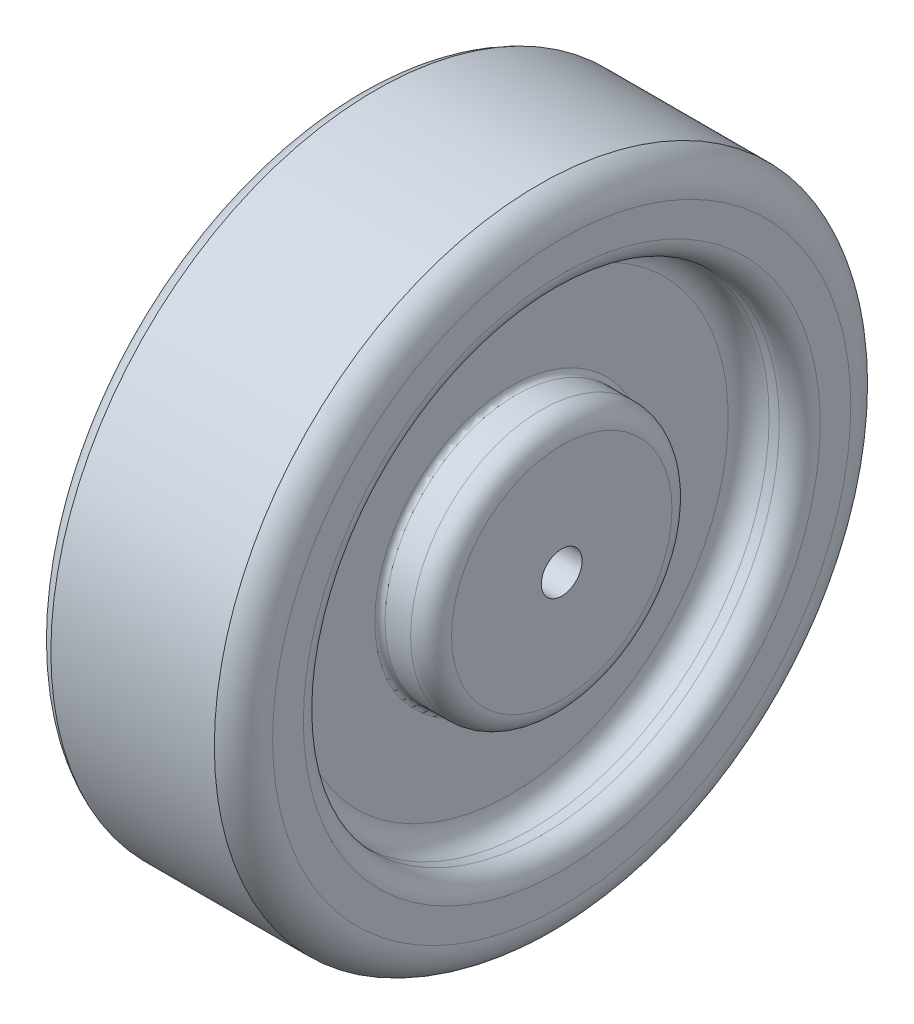
ISO-10303-21;
HEADER;
FILE_DESCRIPTION(('STEP AP214'),'2;1');
FILE_NAME('part.step','',(''),(''),'','','');
FILE_SCHEMA(('AUTOMOTIVE_DESIGN { 1 0 10303 214 1 1 1 1 }'));
ENDSEC;
DATA;
#1=APPLICATION_CONTEXT('core data for automotive mechanical design processes');
#2=APPLICATION_PROTOCOL_DEFINITION('international standard','automotive_design',2000,#1);
#3=PRODUCT_CONTEXT('',#1,'mechanical');
#4=PRODUCT('Part','Part','',(#3));
#5=PRODUCT_RELATED_PRODUCT_CATEGORY('part','',(#4));
#6=PRODUCT_DEFINITION_FORMATION('','',#4);
#7=PRODUCT_DEFINITION_CONTEXT('part definition',#1,'design');
#8=PRODUCT_DEFINITION('design','',#6,#7);
#9=PRODUCT_DEFINITION_SHAPE('','',#8);
#10=(LENGTH_UNIT() NAMED_UNIT(*) SI_UNIT(.MILLI.,.METRE.));
#11=(NAMED_UNIT(*) PLANE_ANGLE_UNIT() SI_UNIT($,.RADIAN.));
#12=(NAMED_UNIT(*) SI_UNIT($,.STERADIAN.) SOLID_ANGLE_UNIT());
#13=UNCERTAINTY_MEASURE_WITH_UNIT(LENGTH_MEASURE(1.E-05),#10,'distance_accuracy_value','');
#14=(GEOMETRIC_REPRESENTATION_CONTEXT(3) GLOBAL_UNCERTAINTY_ASSIGNED_CONTEXT((#13)) GLOBAL_UNIT_ASSIGNED_CONTEXT((#10,
#11,#12)) REPRESENTATION_CONTEXT('',''));
#15=CARTESIAN_POINT('',(0.,0.,0.));
#16=DIRECTION('',(0.,0.,1.));
#17=DIRECTION('',(1.,0.,0.));
#18=AXIS2_PLACEMENT_3D('',#15,#16,#17);
#19=CARTESIAN_POINT('',(13.5100831411217,0.,-3.58222248360619));
#20=DIRECTION('',(-1.,0.,0.));
#21=DIRECTION('',(0.,0.,1.));
#22=AXIS2_PLACEMENT_3D('',#19,#20,#21);
#23=TOROIDAL_SURFACE('',#22,56.9578051056336,7.);
#24=CARTESIAN_POINT('',(20.5,0.,-3.58222248360619));
#25=DIRECTION('',(-1.,0.,0.));
#26=DIRECTION('',(0.,0.,1.));
#27=AXIS2_PLACEMENT_3D('',#24,#25,#26);
#28=CIRCLE('',#27,56.5822224836061);
#29=CARTESIAN_POINT('',(20.5,0.,52.9999999999999));
#30=VERTEX_POINT('',#29);
#31=EDGE_CURVE('E89',#30,#30,#28,.T.);
#32=ORIENTED_EDGE('',*,*,#31,.T.);
#33=EDGE_LOOP('',(#32));
#34=FACE_BOUND('',#33,.T.);
#35=CARTESIAN_POINT('',(16.,0.,-3.58222248360619));
#36=DIRECTION('',(-1.,0.,0.));
#37=DIRECTION('',(0.,0.,1.));
#38=AXIS2_PLACEMENT_3D('',#35,#36,#37);
#39=CIRCLE('',#38,63.5);
#40=CARTESIAN_POINT('',(16.,-63.2036301114344,2.54567607438067));
#41=VERTEX_POINT('',#40);
#42=CARTESIAN_POINT('',(16.,-63.2036301114344,-9.71012104159305));
#43=VERTEX_POINT('',#42);
#44=EDGE_CURVE('E85',#41,#43,#39,.T.);
#45=ORIENTED_EDGE('',*,*,#44,.F.);
#46=CARTESIAN_POINT('',(16.6707270623683,-63.2036301114344,-3.58222248360619));
#47=CARTESIAN_POINT('',(16.6707292954384,-63.2036301114344,-4.17396479603259));
#48=CARTESIAN_POINT('',(16.6544699658295,-63.2036301114344,-4.76571249148176));
#49=CARTESIAN_POINT('',(16.6042972851851,-63.2036301114344,-5.6522356825062));
#50=CARTESIAN_POINT('',(16.5832512617764,-63.2036301114344,-5.94777320771535));
#51=CARTESIAN_POINT('',(16.5319193753858,-63.2036301114344,-6.5380449154142));
#52=CARTESIAN_POINT('',(16.5016339969221,-63.2036301114344,-6.83277913921207));
#53=CARTESIAN_POINT('',(16.4310971773188,-63.2036301114344,-7.41966545961936));
#54=CARTESIAN_POINT('',(16.3908929614594,-63.2036301114344,-7.71182318654436));
#55=CARTESIAN_POINT('',(16.2991330055336,-63.2036301114344,-8.29434503094819));
#56=CARTESIAN_POINT('',(16.24757846675,-63.2036301114344,-8.58470933489647));
#57=CARTESIAN_POINT('',(16.1312813206395,-63.2036301114344,-9.16224071639279));
#58=CARTESIAN_POINT('',(16.0665637722153,-63.2036301114344,-9.44941279152907));
#59=CARTESIAN_POINT('',(15.9210298643362,-63.2036301114344,-10.0195925965211));
#60=CARTESIAN_POINT('',(15.8402229631426,-63.2036301114344,-10.3026026685746));
#61=CARTESIAN_POINT('',(15.7002425886994,-63.2036301114344,-10.7318015172493));
#62=CARTESIAN_POINT('',(15.6484854062445,-63.2036301114344,-10.880410402469));
#63=CARTESIAN_POINT('',(15.5379115914836,-63.2036301114344,-11.1750407205738));
#64=CARTESIAN_POINT('',(15.4790936899521,-63.2036301114344,-11.3210616828272));
#65=CARTESIAN_POINT('',(15.3532741706873,-63.2036301114344,-11.6087313272144));
#66=CARTESIAN_POINT('',(15.2863131973197,-63.2036301114344,-11.7503976344701));
#67=CARTESIAN_POINT('',(15.1419754435748,-63.2036301114344,-12.0284259948148));
#68=CARTESIAN_POINT('',(15.0646000210597,-63.2036301114344,-12.1647887364135));
#69=CARTESIAN_POINT('',(14.9245902761068,-63.2036301114344,-12.385006690551));
#70=CARTESIAN_POINT('',(14.865652843502,-63.2036301114344,-12.471199105611));
#71=CARTESIAN_POINT('',(14.7407382932956,-63.2036301114344,-12.638252843262));
#72=CARTESIAN_POINT('',(14.674769569871,-63.2036301114344,-12.7191203403023));
#73=CARTESIAN_POINT('',(14.5336261190339,-63.2036301114344,-12.8740162026535));
#74=CARTESIAN_POINT('',(14.4583652202557,-63.2036301114344,-12.947967329304));
#75=CARTESIAN_POINT('',(14.2976771951023,-63.2036301114344,-13.0839426676957));
#76=CARTESIAN_POINT('',(14.2122765911409,-63.2036301114344,-13.1459969316784));
#77=CARTESIAN_POINT('',(14.0630478778912,-63.2036301114344,-13.2329681788717));
#78=CARTESIAN_POINT('',(14.0023712240624,-63.2036301114344,-13.2632400984011));
#79=CARTESIAN_POINT('',(13.8770340056613,-63.2036301114344,-13.3139992865462));
#80=CARTESIAN_POINT('',(13.8123782784055,-63.2036301114344,-13.3344981808211));
#81=CARTESIAN_POINT('',(13.6797860652982,-63.2036301114344,-13.3638112738452));
#82=CARTESIAN_POINT('',(13.6118254003782,-63.2036301114344,-13.372519278864));
#83=CARTESIAN_POINT('',(13.4754905390389,-63.2036301114344,-13.3767846314576));
#84=CARTESIAN_POINT('',(13.4071164533096,-63.2036301114344,-13.3723453559382));
#85=CARTESIAN_POINT('',(13.2794513774294,-63.2036301114344,-13.3520425533232));
#86=CARTESIAN_POINT('',(13.2199551888265,-63.2036301114344,-13.3374149457909));
#87=CARTESIAN_POINT('',(13.1038412038322,-63.2036301114344,-13.29943930008));
#88=CARTESIAN_POINT('',(13.0472251717934,-63.2036301114344,-13.2760859880088));
#89=CARTESIAN_POINT('',(12.9066097761618,-63.2036301114344,-13.2071154202081));
#90=CARTESIAN_POINT('',(12.8251438833695,-63.2036301114344,-13.1563663681346));
#91=CARTESIAN_POINT('',(12.6709369166726,-63.2036301114344,-13.042999320279));
#92=CARTESIAN_POINT('',(12.598222850398,-63.2036301114344,-12.9803460489353));
#93=CARTESIAN_POINT('',(12.4661618232911,-63.2036301114344,-12.8524078081409));
#94=CARTESIAN_POINT('',(12.4062107665912,-63.2036301114344,-12.7877350691528));
#95=CARTESIAN_POINT('',(12.2920066418069,-63.2036301114344,-12.6535057755729));
#96=CARTESIAN_POINT('',(12.2377587984906,-63.2036301114344,-12.5839448385105));
#97=CARTESIAN_POINT('',(12.0821510808705,-63.2036301114344,-12.3697464569932));
#98=CARTESIAN_POINT('',(11.9881199762365,-63.2036301114344,-12.2197948939072));
#99=CARTESIAN_POINT('',(11.8366795173049,-63.2036301114344,-11.9509146105457));
#100=CARTESIAN_POINT('',(11.7760229009024,-63.2036301114344,-11.8337321002457));
#101=CARTESIAN_POINT('',(11.6614575369207,-63.2036301114344,-11.5960921177149));
#102=CARTESIAN_POINT('',(11.6075497438011,-63.2036301114344,-11.4756341851797));
#103=CARTESIAN_POINT('',(11.4541061262071,-63.2036301114344,-11.1103037739533));
#104=CARTESIAN_POINT('',(11.3630648657373,-63.2036301114344,-10.8618773201212));
#105=CARTESIAN_POINT('',(11.1975097110628,-63.2036301114344,-10.3584369639931));
#106=CARTESIAN_POINT('',(11.1230770408299,-63.2036301114344,-10.1033972152309));
#107=CARTESIAN_POINT('',(10.9878635021161,-63.2036301114344,-9.59004266804796));
#108=CARTESIAN_POINT('',(10.9270689106355,-63.2036301114344,-9.33173144057175));
#109=CARTESIAN_POINT('',(10.7923023976279,-63.2036301114344,-8.69813742547499));
#110=CARTESIAN_POINT('',(10.7243688989411,-63.2036301114344,-8.32157874943023));
#111=CARTESIAN_POINT('',(10.6073374146122,-63.2036301114344,-7.5654836893905));
#112=CARTESIAN_POINT('',(10.5582465674594,-63.2036301114344,-7.18594623234881));
#113=CARTESIAN_POINT('',(10.4762395281938,-63.2036301114344,-6.42443072444686));
#114=CARTESIAN_POINT('',(10.4433538414906,-63.2036301114344,-6.04244943145213));
#115=CARTESIAN_POINT('',(10.3923139854471,-63.2036301114344,-5.2774999286154));
#116=CARTESIAN_POINT('',(10.3741606342692,-63.2036301114344,-4.8945316651465));
#117=CARTESIAN_POINT('',(10.3517410698331,-63.2036301114344,-4.12682592058159));
#118=CARTESIAN_POINT('',(10.3475246607196,-63.2036301114344,-3.74208700397479));
#119=CARTESIAN_POINT('',(10.3529346520215,-63.2036301114344,-2.97267226223139));
#120=CARTESIAN_POINT('',(10.3625622289784,-63.2036301114344,-2.58799644523612));
#121=CARTESIAN_POINT('',(10.3960565639377,-63.2036301114344,-1.81991024054774));
#122=CARTESIAN_POINT('',(10.4198991609128,-63.2036301114344,-1.43649881312968));
#123=CARTESIAN_POINT('',(10.482887883794,-63.2036301114344,-0.670973940508993));
#124=CARTESIAN_POINT('',(10.5220314981851,-63.2036301114344,-0.288860292665694));
#125=CARTESIAN_POINT('',(10.6178236001986,-63.2036301114344,0.475094570801808));
#126=CARTESIAN_POINT('',(10.6745569837574,-63.2036301114344,0.856925262431808));
#127=CARTESIAN_POINT('',(10.8088290919646,-63.2036301114344,1.61759154547429));
#128=CARTESIAN_POINT('',(10.8863962939935,-63.2036301114344,1.99642230117206));
#129=CARTESIAN_POINT('',(11.022106895567,-63.2036301114344,2.55790361789568));
#130=CARTESIAN_POINT('',(11.0702658832888,-63.2036301114344,2.74297634096623));
#131=CARTESIAN_POINT('',(11.174144944289,-63.2036301114344,3.11097399443569));
#132=CARTESIAN_POINT('',(11.229863472006,-63.2036301114344,3.29389935558182));
#133=CARTESIAN_POINT('',(11.3501561433257,-63.2036301114344,3.65638789420918));
#134=CARTESIAN_POINT('',(11.414710522836,-63.2036301114344,3.83595758652415));
#135=CARTESIAN_POINT('',(11.5547471313071,-63.2036301114344,4.19074313584963));
#136=CARTESIAN_POINT('',(11.6302214866364,-63.2036301114344,4.36596202416937));
#137=CARTESIAN_POINT('',(11.7431393026857,-63.2036301114344,4.60136323030195));
#138=CARTESIAN_POINT('',(11.7745690154131,-63.2036301114344,4.66444189289422));
#139=CARTESIAN_POINT('',(11.8395554887796,-63.2036301114344,4.78949726630312));
#140=CARTESIAN_POINT('',(11.8731124197646,-63.2036301114344,4.85147388835909));
#141=CARTESIAN_POINT('',(11.9774855443031,-63.2036301114344,5.03572568687158));
#142=CARTESIAN_POINT('',(12.0518704228145,-63.2036301114344,5.15603803001532));
#143=CARTESIAN_POINT('',(12.2132532111794,-63.2036301114344,5.38960456408028));
#144=CARTESIAN_POINT('',(12.3003591757373,-63.2036301114344,5.50278502559764));
#145=CARTESIAN_POINT('',(12.4900376992395,-63.2036301114344,5.71539485682873));
#146=CARTESIAN_POINT('',(12.5925497318154,-63.2036301114344,5.81487524222523));
#147=CARTESIAN_POINT('',(12.7619114318647,-63.2036301114344,5.94703293028489));
#148=CARTESIAN_POINT('',(12.8217513124302,-63.2036301114344,5.98861929432739));
#149=CARTESIAN_POINT('',(12.9466415402434,-63.2036301114344,6.06321738996163));
#150=CARTESIAN_POINT('',(13.0116898113155,-63.2036301114344,6.09623251618592));
#151=CARTESIAN_POINT('',(13.1473419165893,-63.2036301114344,6.15134825216223));
#152=CARTESIAN_POINT('',(13.2180053516551,-63.2036301114344,6.17330631390429));
#153=CARTESIAN_POINT('',(13.3622488804833,-63.2036301114344,6.20295821581505));
#154=CARTESIAN_POINT('',(13.4358236036928,-63.2036301114344,6.21067717521244));
#155=CARTESIAN_POINT('',(13.573997842206,-63.2036301114344,6.21078137378157));
#156=CARTESIAN_POINT('',(13.6386012536015,-63.2036301114344,6.20491641059763));
#157=CARTESIAN_POINT('',(13.7658172145653,-63.2036301114344,6.18207391763984));
#158=CARTESIAN_POINT('',(13.8284278593843,-63.2036301114344,6.16508607207167));
#159=CARTESIAN_POINT('',(13.9666268698251,-63.2036301114344,6.11578839943371));
#160=CARTESIAN_POINT('',(14.0411690432026,-63.2036301114344,6.08058424085594));
#161=CARTESIAN_POINT('',(14.1836962770983,-63.2036301114344,5.9988186351449));
#162=CARTESIAN_POINT('',(14.251667333613,-63.2036301114344,5.95223364744086));
#163=CARTESIAN_POINT('',(14.4252734573507,-63.2036301114344,5.81660069013155));
#164=CARTESIAN_POINT('',(14.525104167799,-63.2036301114344,5.72021347843628));
#165=CARTESIAN_POINT('',(14.7101143768368,-63.2036301114344,5.51440180169272));
#166=CARTESIAN_POINT('',(14.7952494541477,-63.2036301114344,5.40493944448867));
#167=CARTESIAN_POINT('',(14.9817095393585,-63.2036301114344,5.13842735391843));
#168=CARTESIAN_POINT('',(15.0783050100692,-63.2036301114344,4.97810910944326));
#169=CARTESIAN_POINT('',(15.2561173954845,-63.2036301114344,4.64904156901644));
#170=CARTESIAN_POINT('',(15.3373033130139,-63.2036301114344,4.48027612455189));
#171=CARTESIAN_POINT('',(15.4880064766111,-63.2036301114344,4.1367419288078));
#172=CARTESIAN_POINT('',(15.5574680299165,-63.2036301114344,3.96194902633201));
#173=CARTESIAN_POINT('',(15.6865902778599,-63.2036301114344,3.60901221541521));
#174=CARTESIAN_POINT('',(15.7462596556362,-63.2036301114344,3.43087143364931));
#175=CARTESIAN_POINT('',(15.8870045022307,-63.2036301114344,2.9772494407193));
#176=CARTESIAN_POINT('',(15.9627139421572,-63.2036301114344,2.70010857469322));
#177=CARTESIAN_POINT('',(16.0993630520884,-63.2036301114344,2.14216124787295));
#178=CARTESIAN_POINT('',(16.1602957438039,-63.2036301114344,1.86135312093346));
#179=CARTESIAN_POINT('',(16.269957117491,-63.2036301114344,1.2968698600959));
#180=CARTESIAN_POINT('',(16.3186639297192,-63.2036301114344,1.01319051962561));
#181=CARTESIAN_POINT('',(16.4054509911811,-63.2036301114344,0.444188756371415));
#182=CARTESIAN_POINT('',(16.4435296449968,-63.2036301114344,0.158866093458514));
#183=CARTESIAN_POINT('',(16.5103307273529,-63.2036301114344,-0.413774970616493));
#184=CARTESIAN_POINT('',(16.5390233007973,-63.2036301114344,-0.701096827346271));
#185=CARTESIAN_POINT('',(16.5876851092299,-63.2036301114344,-1.27648521894518));
#186=CARTESIAN_POINT('',(16.607653726756,-63.2036301114344,-1.56455180507355));
#187=CARTESIAN_POINT('',(16.6552735356061,-63.2036301114344,-2.42868374732805));
#188=CARTESIAN_POINT('',(16.6707248857923,-63.2036301114344,-3.00545055841725));
#189=CARTESIAN_POINT('',(16.6707270623683,-63.2036301114344,-3.58222248360619));
#190=B_SPLINE_CURVE_WITH_KNOTS('',3,(#46,#47,#48,#49,#50,#51,#52,#53,#54,#55,#56,#57,#58,#59,
#60,#61,#62,#63,#64,#65,#66,#67,#68,#69,#70,#71,#72,#73,#74,#75,#76,#77,#78,#79,#80,#81,#82,#83,
#84,#85,#86,#87,#88,#89,#90,#91,#92,#93,#94,#95,#96,#97,#98,#99,#100,#101,#102,#103,#104,#105,
#106,#107,#108,#109,#110,#111,#112,#113,#114,#115,#116,#117,#118,#119,#120,#121,#122,#123,#124,
#125,#126,#127,#128,#129,#130,#131,#132,#133,#134,#135,#136,#137,#138,#139,#140,#141,#142,#143,
#144,#145,#146,#147,#148,#149,#150,#151,#152,#153,#154,#155,#156,#157,#158,#159,#160,#161,#162,
#163,#164,#165,#166,#167,#168,#169,#170,#171,#172,#173,#174,#175,#176,#177,#178,#179,#180,#181,
#182,#183,#184,#185,#186,#187,#188,#189),.UNSPECIFIED.,.T.,.F.,(4,2,2,2,2,2,2,2,2,2,2,2,2,2,2,2,
2,2,2,2,2,2,2,2,2,2,2,2,2,2,2,2,2,2,2,2,2,2,2,2,2,2,2,2,2,2,2,2,2,2,2,2,2,2,2,2,2,2,2,2,2,2,2,2,
2,2,2,2,2,2,2,4),(0.,1.7749163557717,2.66365804093925,3.55235312788315,4.43689599043852,
5.3213452806886,6.2041263127909,7.08638991872182,7.55834551878795,8.03038608435295,
8.50016045788951,8.96987364027671,9.28284606226785,9.59544894642369,9.91120595143281,
10.2261545095402,10.4289177282901,10.6314391412284,10.8357726787345,11.0400537373073,
11.2230931692077,11.406243411187,11.6925312041245,11.9796809667544,12.2438425606726,
12.5082440846066,13.0378759730827,13.4335495027397,13.8292789278861,14.6221006000629,
15.4187184767629,16.2145311434629,17.3618128735386,18.5095288203068,19.6593971095767,
20.8093292525934,21.963366300568,23.1175014310373,24.2696804678306,25.4216704648711,
26.5793093775327,27.7385387709967,28.3121241089263,28.8855923525454,29.4577982061147,
30.029593519309,30.2409831115643,30.4523896531567,30.876144400904,31.3037340944577,
31.7296858130306,31.9477704760255,32.1657686345284,32.3865095539358,32.6068606900769,
32.8004277041079,32.9941744944984,33.2401011488211,33.4865408599805,33.9004968728058,
34.3156830568318,34.8758679452693,35.4371680039533,36.00106355744,36.5644563468123,
37.4257746902768,38.2874990009168,39.1507539580047,40.0141384307289,40.8802430279804,
41.7464089162402,43.4764219676478),.UNSPECIFIED.);
#191=EDGE_CURVE('E74',#41,#43,#190,.T.);
#192=ORIENTED_EDGE('',*,*,#191,.T.);
#193=EDGE_LOOP('',(#45,#192));
#194=FACE_BOUND('',#193,.T.);
#195=ADVANCED_FACE('F46',(#34,#194),#23,.T.);
#196=CARTESIAN_POINT('',(-20.5,0.,-3.58222248360619));
#197=DIRECTION('',(-1.,0.,0.));
#198=DIRECTION('',(0.,0.,1.));
#199=AXIS2_PLACEMENT_3D('',#196,#197,#198);
#200=CYLINDRICAL_SURFACE('',#199,63.5);
#201=ORIENTED_EDGE('',*,*,#44,.T.);
#202=DIRECTION('',(-1.,0.,0.));
#203=VECTOR('',#202,1.);
#204=CARTESIAN_POINT('',(43.5,-63.2036301114344,-9.71012104159305));
#205=LINE('',#204,#203);
#206=CARTESIAN_POINT('',(-16.,-63.2036301114344,-9.71012104159305));
#207=VERTEX_POINT('',#206);
#208=EDGE_CURVE('E76',#43,#207,#205,.T.);
#209=ORIENTED_EDGE('',*,*,#208,.T.);
#210=CARTESIAN_POINT('',(-16.,0.,-3.58222248360619));
#211=DIRECTION('',(-1.,0.,0.));
#212=DIRECTION('',(0.,0.,1.));
#213=AXIS2_PLACEMENT_3D('',#210,#211,#212);
#214=CIRCLE('',#213,63.5);
#215=CARTESIAN_POINT('',(-16.,-63.2036301114344,2.54567607438067));
#216=VERTEX_POINT('',#215);
#217=EDGE_CURVE('E87',#216,#207,#214,.T.);
#218=ORIENTED_EDGE('',*,*,#217,.F.);
#219=DIRECTION('',(-1.,0.,0.));
#220=VECTOR('',#219,1.);
#221=CARTESIAN_POINT('',(43.5,-63.2036301114344,2.54567607438067));
#222=LINE('',#221,#220);
#223=EDGE_CURVE('E66',#41,#216,#222,.T.);
#224=ORIENTED_EDGE('',*,*,#223,.F.);
#225=EDGE_LOOP('',(#201,#209,#218,#224));
#226=FACE_BOUND('',#225,.T.);
#227=ADVANCED_FACE('F84',(#226),#200,.T.);
#228=CARTESIAN_POINT('',(-13.5100831411217,0.,-3.58222248360619));
#229=DIRECTION('',(-1.,0.,0.));
#230=DIRECTION('',(0.,0.,1.));
#231=AXIS2_PLACEMENT_3D('',#228,#229,#230);
#232=TOROIDAL_SURFACE('',#231,56.9578051056336,7.);
#233=CARTESIAN_POINT('',(-20.5,0.,-3.58222248360619));
#234=DIRECTION('',(-1.,0.,0.));
#235=DIRECTION('',(0.,0.,1.));
#236=AXIS2_PLACEMENT_3D('',#233,#234,#235);
#237=CIRCLE('',#236,56.5822224836061);
#238=CARTESIAN_POINT('',(-20.5,0.,53.));
#239=VERTEX_POINT('',#238);
#240=EDGE_CURVE('E94',#239,#239,#237,.T.);
#241=ORIENTED_EDGE('',*,*,#240,.F.);
#242=EDGE_LOOP('',(#241));
#243=FACE_BOUND('',#242,.T.);
#244=ORIENTED_EDGE('',*,*,#217,.T.);
#245=CARTESIAN_POINT('',(-16.6707270623683,-63.2036301114344,-3.58222248360619));
#246=CARTESIAN_POINT('',(-16.6707292954384,-63.2036301114344,-2.99048017117978));
#247=CARTESIAN_POINT('',(-16.6544699658295,-63.2036301114344,-2.39873247573061));
#248=CARTESIAN_POINT('',(-16.6042972851851,-63.2036301114344,-1.51220928470616));
#249=CARTESIAN_POINT('',(-16.5832512617764,-63.2036301114344,-1.21667175949702));
#250=CARTESIAN_POINT('',(-16.5319193753858,-63.2036301114344,-0.626400051798154));
#251=CARTESIAN_POINT('',(-16.5016339969221,-63.2036301114344,-0.331665828000284));
#252=CARTESIAN_POINT('',(-16.4310971773188,-63.2036301114344,0.255220492407003));
#253=CARTESIAN_POINT('',(-16.3908929614594,-63.2036301114344,0.547378219331999));
#254=CARTESIAN_POINT('',(-16.2991330055336,-63.2036301114344,1.12990006373583));
#255=CARTESIAN_POINT('',(-16.24757846675,-63.2036301114344,1.4202643676841));
#256=CARTESIAN_POINT('',(-16.1312813206395,-63.2036301114344,1.99779574918042));
#257=CARTESIAN_POINT('',(-16.0665637722153,-63.2036301114344,2.2849678243167));
#258=CARTESIAN_POINT('',(-15.9210298643362,-63.2036301114344,2.85514762930877));
#259=CARTESIAN_POINT('',(-15.8402229631426,-63.2036301114344,3.13815770136224));
#260=CARTESIAN_POINT('',(-15.7002425886993,-63.2036301114344,3.56735655003688));
#261=CARTESIAN_POINT('',(-15.6484854062445,-63.2036301114344,3.71596543525657));
#262=CARTESIAN_POINT('',(-15.5379115914835,-63.2036301114344,4.01059575336142));
#263=CARTESIAN_POINT('',(-15.4790936899521,-63.2036301114344,4.15661671561476));
#264=CARTESIAN_POINT('',(-15.3532741706873,-63.2036301114344,4.44428636000205));
#265=CARTESIAN_POINT('',(-15.2863131973197,-63.2036301114344,4.58595266725773));
#266=CARTESIAN_POINT('',(-15.1419754435747,-63.2036301114344,4.86398102760239));
#267=CARTESIAN_POINT('',(-15.0646000210597,-63.2036301114344,5.00034376920114));
#268=CARTESIAN_POINT('',(-14.9245902761068,-63.2036301114344,5.22056172333857));
#269=CARTESIAN_POINT('',(-14.865652843502,-63.2036301114344,5.30675413839855));
#270=CARTESIAN_POINT('',(-14.7407382932956,-63.2036301114344,5.47380787604963));
#271=CARTESIAN_POINT('',(-14.674769569871,-63.2036301114344,5.55467537308992));
#272=CARTESIAN_POINT('',(-14.5336261190339,-63.2036301114344,5.70957123544115));
#273=CARTESIAN_POINT('',(-14.4583652202557,-63.2036301114344,5.78352236209156));
#274=CARTESIAN_POINT('',(-14.2976771951023,-63.2036301114344,5.91949770048326));
#275=CARTESIAN_POINT('',(-14.2122765911409,-63.2036301114344,5.98155196446597));
#276=CARTESIAN_POINT('',(-14.0630478778912,-63.2036301114344,6.06852321165933));
#277=CARTESIAN_POINT('',(-14.0023712240624,-63.2036301114344,6.09879513118867));
#278=CARTESIAN_POINT('',(-13.8770340056612,-63.2036301114344,6.1495543193338));
#279=CARTESIAN_POINT('',(-13.8123782784055,-63.2036301114344,6.17005321360867));
#280=CARTESIAN_POINT('',(-13.6797860652982,-63.2036301114344,6.19936630663283));
#281=CARTESIAN_POINT('',(-13.6118254003782,-63.2036301114344,6.20807431165153));
#282=CARTESIAN_POINT('',(-13.4754905390389,-63.2036301114344,6.21233966424512));
#283=CARTESIAN_POINT('',(-13.4071164533096,-63.2036301114344,6.20790038872579));
#284=CARTESIAN_POINT('',(-13.2794513774294,-63.2036301114344,6.18759758611083));
#285=CARTESIAN_POINT('',(-13.2199551888265,-63.2036301114344,6.17296997857846));
#286=CARTESIAN_POINT('',(-13.1038412038322,-63.2036301114344,6.13499433286762));
#287=CARTESIAN_POINT('',(-13.0472251717934,-63.2036301114344,6.11164102079634));
#288=CARTESIAN_POINT('',(-12.9066097761618,-63.2036301114344,6.0426704529957));
#289=CARTESIAN_POINT('',(-12.8251438833695,-63.2036301114344,5.99192140092216));
#290=CARTESIAN_POINT('',(-12.6709369166727,-63.2036301114344,5.87855435306659));
#291=CARTESIAN_POINT('',(-12.598222850398,-63.2036301114344,5.81590108172292));
#292=CARTESIAN_POINT('',(-12.4661618232911,-63.2036301114344,5.68796284092857));
#293=CARTESIAN_POINT('',(-12.4062107665912,-63.2036301114344,5.62329010194048));
#294=CARTESIAN_POINT('',(-12.2920066418069,-63.2036301114344,5.4890608083605));
#295=CARTESIAN_POINT('',(-12.2377587984906,-63.2036301114344,5.4194998712981));
#296=CARTESIAN_POINT('',(-12.0821510808706,-63.2036301114344,5.20530148978079));
#297=CARTESIAN_POINT('',(-11.9881199762365,-63.2036301114344,5.0553499266948));
#298=CARTESIAN_POINT('',(-11.8366795173049,-63.2036301114344,4.78646964333334));
#299=CARTESIAN_POINT('',(-11.7760229009024,-63.2036301114344,4.66928713303327));
#300=CARTESIAN_POINT('',(-11.6614575369207,-63.2036301114344,4.43164715050247));
#301=CARTESIAN_POINT('',(-11.6075497438012,-63.2036301114344,4.31118921796725));
#302=CARTESIAN_POINT('',(-11.4541061262071,-63.2036301114344,3.94585880674084));
#303=CARTESIAN_POINT('',(-11.3630648657373,-63.2036301114344,3.69743235290872));
#304=CARTESIAN_POINT('',(-11.1975097110628,-63.2036301114344,3.19399199678066));
#305=CARTESIAN_POINT('',(-11.1230770408299,-63.2036301114344,2.93895224801848));
#306=CARTESIAN_POINT('',(-10.9878635021161,-63.2036301114344,2.42559770083555));
#307=CARTESIAN_POINT('',(-10.9270689106355,-63.2036301114344,2.16728647335933));
#308=CARTESIAN_POINT('',(-10.792302397628,-63.2036301114344,1.53369245826257));
#309=CARTESIAN_POINT('',(-10.7243688989411,-63.2036301114344,1.15713378221782));
#310=CARTESIAN_POINT('',(-10.6073374146122,-63.2036301114344,0.401038722178098));
#311=CARTESIAN_POINT('',(-10.5582465674594,-63.2036301114344,0.021501265136411));
#312=CARTESIAN_POINT('',(-10.4762395281938,-63.2036301114344,-0.740014242765525));
#313=CARTESIAN_POINT('',(-10.4433538414907,-63.2036301114344,-1.12199553576026));
#314=CARTESIAN_POINT('',(-10.3923139854471,-63.2036301114344,-1.88694503859698));
#315=CARTESIAN_POINT('',(-10.3741606342692,-63.2036301114344,-2.26991330206587));
#316=CARTESIAN_POINT('',(-10.3517410698331,-63.2036301114344,-3.03761904663078));
#317=CARTESIAN_POINT('',(-10.3475246607196,-63.2036301114344,-3.42235796323757));
#318=CARTESIAN_POINT('',(-10.3529346520215,-63.2036301114344,-4.19177270498098));
#319=CARTESIAN_POINT('',(-10.3625622289784,-63.2036301114344,-4.57644852197625));
#320=CARTESIAN_POINT('',(-10.3960565639377,-63.2036301114344,-5.34453472666464));
#321=CARTESIAN_POINT('',(-10.4198991609128,-63.2036301114344,-5.72794615408269));
#322=CARTESIAN_POINT('',(-10.482887883794,-63.2036301114344,-6.49347102670338));
#323=CARTESIAN_POINT('',(-10.5220314981851,-63.2036301114344,-6.87558467454668));
#324=CARTESIAN_POINT('',(-10.6178236001987,-63.2036301114344,-7.63953953801418));
#325=CARTESIAN_POINT('',(-10.6745569837574,-63.2036301114344,-8.02137022964418));
#326=CARTESIAN_POINT('',(-10.8088290919646,-63.2036301114344,-8.78203651268666));
#327=CARTESIAN_POINT('',(-10.8863962939935,-63.2036301114344,-9.16086726838443));
#328=CARTESIAN_POINT('',(-11.022106895567,-63.2036301114344,-9.72234858510805));
#329=CARTESIAN_POINT('',(-11.0702658832889,-63.2036301114344,-9.9074213081786));
#330=CARTESIAN_POINT('',(-11.174144944289,-63.2036301114344,-10.2754189616481));
#331=CARTESIAN_POINT('',(-11.2298634720061,-63.2036301114344,-10.4583443227942));
#332=CARTESIAN_POINT('',(-11.3501561433257,-63.2036301114344,-10.8208328614215));
#333=CARTESIAN_POINT('',(-11.414710522836,-63.2036301114344,-11.0004025537365));
#334=CARTESIAN_POINT('',(-11.554747131307,-63.2036301114344,-11.355188103062));
#335=CARTESIAN_POINT('',(-11.6302214866364,-63.2036301114344,-11.5304069913817));
#336=CARTESIAN_POINT('',(-11.7431393026858,-63.2036301114344,-11.7658081975143));
#337=CARTESIAN_POINT('',(-11.7745690154131,-63.2036301114344,-11.8288868601066));
#338=CARTESIAN_POINT('',(-11.8395554887796,-63.2036301114344,-11.9539422335155));
#339=CARTESIAN_POINT('',(-11.8731124197646,-63.2036301114344,-12.0159188555714));
#340=CARTESIAN_POINT('',(-11.9774855443031,-63.2036301114344,-12.2001706540839));
#341=CARTESIAN_POINT('',(-12.0518704228146,-63.2036301114344,-12.3204829972277));
#342=CARTESIAN_POINT('',(-12.2132532111794,-63.2036301114344,-12.5540495312926));
#343=CARTESIAN_POINT('',(-12.3003591757374,-63.2036301114344,-12.66722999281));
#344=CARTESIAN_POINT('',(-12.4900376992395,-63.2036301114344,-12.8798398240411));
#345=CARTESIAN_POINT('',(-12.5925497318154,-63.2036301114344,-12.9793202094376));
#346=CARTESIAN_POINT('',(-12.7619114318647,-63.2036301114344,-13.1114778974973));
#347=CARTESIAN_POINT('',(-12.8217513124302,-63.2036301114344,-13.1530642615397));
#348=CARTESIAN_POINT('',(-12.9466415402434,-63.2036301114344,-13.227662357174));
#349=CARTESIAN_POINT('',(-13.0116898113155,-63.2036301114344,-13.2606774833983));
#350=CARTESIAN_POINT('',(-13.1473419165892,-63.2036301114344,-13.3157932193746));
#351=CARTESIAN_POINT('',(-13.218005351655,-63.2036301114344,-13.3377512811167));
#352=CARTESIAN_POINT('',(-13.3622488804833,-63.2036301114344,-13.3674031830274));
#353=CARTESIAN_POINT('',(-13.4358236036928,-63.2036301114344,-13.3751221424247));
#354=CARTESIAN_POINT('',(-13.573997842206,-63.2036301114344,-13.3752263409939));
#355=CARTESIAN_POINT('',(-13.6386012536015,-63.2036301114344,-13.36936137781));
#356=CARTESIAN_POINT('',(-13.7658172145652,-63.2036301114344,-13.3465188848523));
#357=CARTESIAN_POINT('',(-13.8284278593843,-63.2036301114344,-13.3295310392841));
#358=CARTESIAN_POINT('',(-13.966626869825,-63.2036301114344,-13.2802333666461));
#359=CARTESIAN_POINT('',(-14.0411690432026,-63.2036301114344,-13.2450292080683));
#360=CARTESIAN_POINT('',(-14.1836962770983,-63.2036301114344,-13.1632636023572));
#361=CARTESIAN_POINT('',(-14.251667333613,-63.2036301114344,-13.1166786146533));
#362=CARTESIAN_POINT('',(-14.4252734573507,-63.2036301114344,-12.981045657344));
#363=CARTESIAN_POINT('',(-14.525104167799,-63.2036301114344,-12.8846584456487));
#364=CARTESIAN_POINT('',(-14.7101143768368,-63.2036301114344,-12.6788467689051));
#365=CARTESIAN_POINT('',(-14.7952494541477,-63.2036301114344,-12.5693844117011));
#366=CARTESIAN_POINT('',(-14.9817095393585,-63.2036301114344,-12.3028723211309));
#367=CARTESIAN_POINT('',(-15.0783050100692,-63.2036301114344,-12.1425540766557));
#368=CARTESIAN_POINT('',(-15.2561173954844,-63.2036301114344,-11.8134865362289));
#369=CARTESIAN_POINT('',(-15.3373033130139,-63.2036301114344,-11.6447210917644));
#370=CARTESIAN_POINT('',(-15.488006476611,-63.2036301114344,-11.3011868960203));
#371=CARTESIAN_POINT('',(-15.5574680299165,-63.2036301114344,-11.1263939935445));
#372=CARTESIAN_POINT('',(-15.6865902778598,-63.2036301114344,-10.7734571826277));
#373=CARTESIAN_POINT('',(-15.7462596556362,-63.2036301114344,-10.5953164008618));
#374=CARTESIAN_POINT('',(-15.8870045022306,-63.2036301114344,-10.1416944079318));
#375=CARTESIAN_POINT('',(-15.9627139421572,-63.2036301114344,-9.86455354190574));
#376=CARTESIAN_POINT('',(-16.0993630520883,-63.2036301114344,-9.30660621508546));
#377=CARTESIAN_POINT('',(-16.1602957438038,-63.2036301114344,-9.02579808814595));
#378=CARTESIAN_POINT('',(-16.269957117491,-63.2036301114344,-8.46131482730838));
#379=CARTESIAN_POINT('',(-16.3186639297192,-63.2036301114344,-8.17763548683809));
#380=CARTESIAN_POINT('',(-16.4054509911811,-63.2036301114344,-7.60863372358389));
#381=CARTESIAN_POINT('',(-16.4435296449968,-63.2036301114344,-7.32331106067098));
#382=CARTESIAN_POINT('',(-16.5103307273529,-63.2036301114344,-6.75066999659596));
#383=CARTESIAN_POINT('',(-16.5390233007973,-63.2036301114344,-6.46334813986618));
#384=CARTESIAN_POINT('',(-16.5876851092298,-63.2036301114344,-5.88795974826726));
#385=CARTESIAN_POINT('',(-16.607653726756,-63.2036301114344,-5.59989316213888));
#386=CARTESIAN_POINT('',(-16.6552735356061,-63.2036301114344,-4.73576121988437));
#387=CARTESIAN_POINT('',(-16.6707248857923,-63.2036301114344,-4.15899440879514));
#388=CARTESIAN_POINT('',(-16.6707270623683,-63.2036301114344,-3.58222248360619));
#389=B_SPLINE_CURVE_WITH_KNOTS('',3,(#245,#246,#247,#248,#249,#250,#251,#252,#253,#254,#255,
#256,#257,#258,#259,#260,#261,#262,#263,#264,#265,#266,#267,#268,#269,#270,#271,#272,#273,#274,
#275,#276,#277,#278,#279,#280,#281,#282,#283,#284,#285,#286,#287,#288,#289,#290,#291,#292,#293,
#294,#295,#296,#297,#298,#299,#300,#301,#302,#303,#304,#305,#306,#307,#308,#309,#310,#311,#312,
#313,#314,#315,#316,#317,#318,#319,#320,#321,#322,#323,#324,#325,#326,#327,#328,#329,#330,#331,
#332,#333,#334,#335,#336,#337,#338,#339,#340,#341,#342,#343,#344,#345,#346,#347,#348,#349,#350,
#351,#352,#353,#354,#355,#356,#357,#358,#359,#360,#361,#362,#363,#364,#365,#366,#367,#368,#369,
#370,#371,#372,#373,#374,#375,#376,#377,#378,#379,#380,#381,#382,#383,#384,#385,#386,#387,#388),
.UNSPECIFIED.,.T.,.F.,(4,2,2,2,2,2,2,2,2,2,2,2,2,2,2,2,2,2,2,2,2,2,2,2,2,2,2,2,2,2,2,2,2,2,2,2,
2,2,2,2,2,2,2,2,2,2,2,2,2,2,2,2,2,2,2,2,2,2,2,2,2,2,2,2,2,2,2,2,2,2,2,4),(0.,1.77491635577172,
2.66365804093927,3.55235312788318,4.43689599043854,5.32134528068862,6.20412631279091,
7.08638991872182,7.55834551878794,8.03038608435293,8.50016045788949,8.9698736402767,
9.28284606226783,9.59544894642366,9.91120595143278,10.2261545095402,10.42891772829,
10.6314391412284,10.8357726787344,11.0400537373072,11.2230931692076,11.406243411187,
11.6925312041244,11.9796809667543,12.2438425606726,12.5082440846066,13.0378759730826,
13.4335495027397,13.8292789278861,14.6221006000629,15.4187184767629,16.2145311434629,
17.3618128735386,18.5095288203068,19.6593971095766,20.8093292525933,21.9633663005679,
23.1175014310373,24.2696804678305,25.4216704648711,26.5793093775326,27.7385387709966,
28.3121241089262,28.8855923525453,29.4577982061146,30.0295935193089,30.2409831115642,
30.4523896531566,30.8761444009039,31.3037340944576,31.7296858130305,31.9477704760254,
32.1657686345283,32.3865095539357,32.6068606900767,32.8004277041078,32.9941744944983,
33.2401011488209,33.4865408599804,33.9004968728056,34.3156830568316,34.8758679452691,
35.4371680039531,36.0010635574398,36.564456346812,37.4257746902765,38.2874990009165,
39.1507539580045,40.0141384307286,40.8802430279802,41.74640891624,43.4764219676477),.UNSPECIFIED.);
#390=EDGE_CURVE('E11',#207,#216,#389,.T.);
#391=ORIENTED_EDGE('',*,*,#390,.T.);
#392=EDGE_LOOP('',(#244,#391));
#393=FACE_BOUND('',#392,.T.);
#394=ADVANCED_FACE('F125',(#243,#393),#232,.T.);
#395=CARTESIAN_POINT('',(20.5,0.,17.));
#396=DIRECTION('',(1.,0.,0.));
#397=DIRECTION('',(0.,0.,-1.));
#398=AXIS2_PLACEMENT_3D('',#395,#396,#397);
#399=PLANE('',#398);
#400=CARTESIAN_POINT('',(20.5,0.,-3.58222248360619));
#401=DIRECTION('',(-1.,0.,0.));
#402=DIRECTION('',(0.,0.,1.));
#403=AXIS2_PLACEMENT_3D('',#400,#401,#402);
#404=CIRCLE('',#403,21.5822224836062);
#405=CARTESIAN_POINT('',(20.5,0.,18.));
#406=VERTEX_POINT('',#405);
#407=EDGE_CURVE('E59',#406,#406,#404,.T.);
#408=ORIENTED_EDGE('',*,*,#407,.F.);
#409=EDGE_LOOP('',(#408));
#410=FACE_BOUND('',#409,.T.);
#411=CARTESIAN_POINT('',(20.5,0.,-3.58222248360619));
#412=DIRECTION('',(-1.,0.,0.));
#413=DIRECTION('',(0.,0.,1.));
#414=AXIS2_PLACEMENT_3D('',#411,#412,#413);
#415=CIRCLE('',#414,4.);
#416=CARTESIAN_POINT('',(20.5,0.,0.417777516393809));
#417=VERTEX_POINT('',#416);
#418=EDGE_CURVE('E128',#417,#417,#415,.T.);
#419=ORIENTED_EDGE('',*,*,#418,.T.);
#420=EDGE_LOOP('',(#419));
#421=FACE_BOUND('',#420,.T.);
#422=ADVANCED_FACE('F48',(#410,#421),#399,.T.);
#423=CARTESIAN_POINT('',(16.5,0.,-3.58222248360619));
#424=DIRECTION('',(-1.,0.,0.));
#425=DIRECTION('',(0.,0.,1.));
#426=AXIS2_PLACEMENT_3D('',#423,#424,#425);
#427=TOROIDAL_SURFACE('',#426,21.5822224836062,4.);
#428=ORIENTED_EDGE('',*,*,#407,.T.);
#429=EDGE_LOOP('',(#428));
#430=FACE_BOUND('',#429,.T.);
#431=CARTESIAN_POINT('',(16.5,0.,-3.58222248360619));
#432=DIRECTION('',(-1.,0.,0.));
#433=DIRECTION('',(0.,0.,1.));
#434=AXIS2_PLACEMENT_3D('',#431,#432,#433);
#435=CIRCLE('',#434,25.5822224836061);
#436=CARTESIAN_POINT('',(16.5,0.,22.));
#437=VERTEX_POINT('',#436);
#438=EDGE_CURVE('E115',#437,#437,#435,.T.);
#439=ORIENTED_EDGE('',*,*,#438,.F.);
#440=EDGE_LOOP('',(#439));
#441=FACE_BOUND('',#440,.T.);
#442=ADVANCED_FACE('F120',(#430,#441),#427,.T.);
#443=CARTESIAN_POINT('',(-20.5,0.,-3.58222248360619));
#444=DIRECTION('',(-1.,0.,0.));
#445=DIRECTION('',(0.,0.,1.));
#446=AXIS2_PLACEMENT_3D('',#443,#444,#445);
#447=CYLINDRICAL_SURFACE('',#446,25.5822224836061);
#448=ORIENTED_EDGE('',*,*,#438,.T.);
#449=EDGE_LOOP('',(#448));
#450=FACE_BOUND('',#449,.T.);
#451=CARTESIAN_POINT('',(11.5,0.,-3.58222248360619));
#452=DIRECTION('',(-1.,0.,0.));
#453=DIRECTION('',(0.,0.,1.));
#454=AXIS2_PLACEMENT_3D('',#451,#452,#453);
#455=CIRCLE('',#454,25.5822224836062);
#456=CARTESIAN_POINT('',(11.5,0.,22.));
#457=VERTEX_POINT('',#456);
#458=EDGE_CURVE('E112',#457,#457,#455,.T.);
#459=ORIENTED_EDGE('',*,*,#458,.F.);
#460=EDGE_LOOP('',(#459));
#461=FACE_BOUND('',#460,.T.);
#462=ADVANCED_FACE('F207',(#450,#461),#447,.T.);
#463=CARTESIAN_POINT('',(11.5,0.,-3.58222248360619));
#464=DIRECTION('',(-1.,0.,0.));
#465=DIRECTION('',(0.,0.,1.));
#466=AXIS2_PLACEMENT_3D('',#463,#464,#465);
#467=TOROIDAL_SURFACE('',#466,26.5822224836062,1.);
#468=ORIENTED_EDGE('',*,*,#458,.T.);
#469=EDGE_LOOP('',(#468));
#470=FACE_BOUND('',#469,.T.);
#471=CARTESIAN_POINT('',(10.5,0.,-3.58222248360619));
#472=DIRECTION('',(-1.,0.,0.));
#473=DIRECTION('',(0.,0.,1.));
#474=AXIS2_PLACEMENT_3D('',#471,#472,#473);
#475=CIRCLE('',#474,26.5822224836062);
#476=CARTESIAN_POINT('',(10.5,0.,23.));
#477=VERTEX_POINT('',#476);
#478=EDGE_CURVE('E109',#477,#477,#475,.T.);
#479=ORIENTED_EDGE('',*,*,#478,.F.);
#480=EDGE_LOOP('',(#479));
#481=FACE_BOUND('',#480,.T.);
#482=ADVANCED_FACE('F203',(#470,#481),#467,.F.);
#483=CARTESIAN_POINT('',(10.5,0.,23.));
#484=DIRECTION('',(1.,0.,0.));
#485=DIRECTION('',(0.,0.,-1.));
#486=AXIS2_PLACEMENT_3D('',#483,#484,#485);
#487=PLANE('',#486);
#488=ORIENTED_EDGE('',*,*,#478,.T.);
#489=EDGE_LOOP('',(#488));
#490=FACE_BOUND('',#489,.T.);
#491=CARTESIAN_POINT('',(10.5,0.,-3.58222248360619));
#492=DIRECTION('',(-1.,0.,0.));
#493=DIRECTION('',(0.,0.,1.));
#494=AXIS2_PLACEMENT_3D('',#491,#492,#493);
#495=CIRCLE('',#494,42.5822224836061);
#496=CARTESIAN_POINT('',(10.5,0.,39.));
#497=VERTEX_POINT('',#496);
#498=EDGE_CURVE('E106',#497,#497,#495,.T.);
#499=ORIENTED_EDGE('',*,*,#498,.F.);
#500=EDGE_LOOP('',(#499));
#501=FACE_BOUND('',#500,.T.);
#502=ADVANCED_FACE('F199',(#490,#501),#487,.T.);
#503=CARTESIAN_POINT('',(14.5,0.,-3.58222248360619));
#504=DIRECTION('',(-1.,0.,0.));
#505=DIRECTION('',(0.,0.,1.));
#506=AXIS2_PLACEMENT_3D('',#503,#504,#505);
#507=TOROIDAL_SURFACE('',#506,42.5822224836061,4.);
#508=ORIENTED_EDGE('',*,*,#498,.T.);
#509=EDGE_LOOP('',(#508));
#510=FACE_BOUND('',#509,.T.);
#511=CARTESIAN_POINT('',(14.5,0.,-3.58222248360619));
#512=DIRECTION('',(-1.,0.,0.));
#513=DIRECTION('',(0.,0.,1.));
#514=AXIS2_PLACEMENT_3D('',#511,#512,#513);
#515=CIRCLE('',#514,46.5822224836061);
#516=CARTESIAN_POINT('',(14.5,0.,43.));
#517=VERTEX_POINT('',#516);
#518=EDGE_CURVE('E103',#517,#517,#515,.T.);
#519=ORIENTED_EDGE('',*,*,#518,.F.);
#520=EDGE_LOOP('',(#519));
#521=FACE_BOUND('',#520,.T.);
#522=ADVANCED_FACE('F195',(#510,#521),#507,.F.);
#523=CARTESIAN_POINT('',(-20.5,0.,-3.58222248360619));
#524=DIRECTION('',(-1.,0.,0.));
#525=DIRECTION('',(0.,0.,1.));
#526=AXIS2_PLACEMENT_3D('',#523,#524,#525);
#527=CYLINDRICAL_SURFACE('',#526,46.5822224836061);
#528=ORIENTED_EDGE('',*,*,#518,.T.);
#529=EDGE_LOOP('',(#528));
#530=FACE_BOUND('',#529,.T.);
#531=CARTESIAN_POINT('',(16.5,0.,-3.58222248360619));
#532=DIRECTION('',(-1.,0.,0.));
#533=DIRECTION('',(0.,0.,1.));
#534=AXIS2_PLACEMENT_3D('',#531,#532,#533);
#535=CIRCLE('',#534,46.5822224836061);
#536=CARTESIAN_POINT('',(16.5,0.,43.));
#537=VERTEX_POINT('',#536);
#538=EDGE_CURVE('E100',#537,#537,#535,.T.);
#539=ORIENTED_EDGE('',*,*,#538,.F.);
#540=EDGE_LOOP('',(#539));
#541=FACE_BOUND('',#540,.T.);
#542=ADVANCED_FACE('F191',(#530,#541),#527,.F.);
#543=CARTESIAN_POINT('',(16.5,0.,-3.58222248360619));
#544=DIRECTION('',(-1.,0.,0.));
#545=DIRECTION('',(0.,0.,1.));
#546=AXIS2_PLACEMENT_3D('',#543,#544,#545);
#547=TOROIDAL_SURFACE('',#546,50.5822224836061,4.);
#548=ORIENTED_EDGE('',*,*,#538,.T.);
#549=EDGE_LOOP('',(#548));
#550=FACE_BOUND('',#549,.T.);
#551=CARTESIAN_POINT('',(20.5,0.,-3.58222248360619));
#552=DIRECTION('',(-1.,0.,0.));
#553=DIRECTION('',(0.,0.,1.));
#554=AXIS2_PLACEMENT_3D('',#551,#552,#553);
#555=CIRCLE('',#554,50.5822224836061);
#556=CARTESIAN_POINT('',(20.5,0.,46.9999999999999));
#557=VERTEX_POINT('',#556);
#558=EDGE_CURVE('E92',#557,#557,#555,.T.);
#559=ORIENTED_EDGE('',*,*,#558,.F.);
#560=EDGE_LOOP('',(#559));
#561=FACE_BOUND('',#560,.T.);
#562=ADVANCED_FACE('F187',(#550,#561),#547,.T.);
#563=CARTESIAN_POINT('',(20.5,0.,52.9999999999999));
#564=DIRECTION('',(1.,0.,0.));
#565=DIRECTION('',(0.,0.,-1.));
#566=AXIS2_PLACEMENT_3D('',#563,#564,#565);
#567=PLANE('',#566);
#568=ORIENTED_EDGE('',*,*,#558,.T.);
#569=EDGE_LOOP('',(#568));
#570=FACE_BOUND('',#569,.T.);
#571=ORIENTED_EDGE('',*,*,#31,.F.);
#572=EDGE_LOOP('',(#571));
#573=FACE_BOUND('',#572,.T.);
#574=ADVANCED_FACE('F184',(#570,#573),#567,.T.);
#575=CARTESIAN_POINT('',(-20.5,0.,48.));
#576=DIRECTION('',(-1.,0.,0.));
#577=DIRECTION('',(0.,0.,1.));
#578=AXIS2_PLACEMENT_3D('',#575,#576,#577);
#579=PLANE('',#578);
#580=ORIENTED_EDGE('',*,*,#240,.T.);
#581=EDGE_LOOP('',(#580));
#582=FACE_BOUND('',#581,.T.);
#583=CARTESIAN_POINT('',(-20.5,0.,-3.58222248360619));
#584=DIRECTION('',(-1.,0.,0.));
#585=DIRECTION('',(0.,0.,1.));
#586=AXIS2_PLACEMENT_3D('',#583,#584,#585);
#587=CIRCLE('',#586,50.5822224836061);
#588=CARTESIAN_POINT('',(-20.5,0.,47.));
#589=VERTEX_POINT('',#588);
#590=EDGE_CURVE('E160',#589,#589,#587,.T.);
#591=ORIENTED_EDGE('',*,*,#590,.F.);
#592=EDGE_LOOP('',(#591));
#593=FACE_BOUND('',#592,.T.);
#594=ADVANCED_FACE('F165',(#582,#593),#579,.T.);
#595=CARTESIAN_POINT('',(-16.5,0.,-3.58222248360619));
#596=DIRECTION('',(-1.,0.,0.));
#597=DIRECTION('',(0.,0.,1.));
#598=AXIS2_PLACEMENT_3D('',#595,#596,#597);
#599=TOROIDAL_SURFACE('',#598,50.5822224836061,4.);
#600=ORIENTED_EDGE('',*,*,#590,.T.);
#601=EDGE_LOOP('',(#600));
#602=FACE_BOUND('',#601,.T.);
#603=CARTESIAN_POINT('',(-16.5,0.,-3.58222248360619));
#604=DIRECTION('',(-1.,0.,0.));
#605=DIRECTION('',(0.,0.,1.));
#606=AXIS2_PLACEMENT_3D('',#603,#604,#605);
#607=CIRCLE('',#606,46.5822224836061);
#608=CARTESIAN_POINT('',(-16.5,0.,43.));
#609=VERTEX_POINT('',#608);
#610=EDGE_CURVE('E157',#609,#609,#607,.T.);
#611=ORIENTED_EDGE('',*,*,#610,.F.);
#612=EDGE_LOOP('',(#611));
#613=FACE_BOUND('',#612,.T.);
#614=ADVANCED_FACE('F258',(#602,#613),#599,.T.);
#615=CARTESIAN_POINT('',(-20.5,0.,-3.58222248360619));
#616=DIRECTION('',(-1.,0.,0.));
#617=DIRECTION('',(0.,0.,1.));
#618=AXIS2_PLACEMENT_3D('',#615,#616,#617);
#619=CYLINDRICAL_SURFACE('',#618,46.5822224836061);
#620=ORIENTED_EDGE('',*,*,#610,.T.);
#621=EDGE_LOOP('',(#620));
#622=FACE_BOUND('',#621,.T.);
#623=CARTESIAN_POINT('',(-14.5,0.,-3.58222248360619));
#624=DIRECTION('',(-1.,0.,0.));
#625=DIRECTION('',(0.,0.,1.));
#626=AXIS2_PLACEMENT_3D('',#623,#624,#625);
#627=CIRCLE('',#626,46.5822224836061);
#628=CARTESIAN_POINT('',(-14.5,0.,43.));
#629=VERTEX_POINT('',#628);
#630=EDGE_CURVE('E154',#629,#629,#627,.T.);
#631=ORIENTED_EDGE('',*,*,#630,.F.);
#632=EDGE_LOOP('',(#631));
#633=FACE_BOUND('',#632,.T.);
#634=ADVANCED_FACE('F264',(#622,#633),#619,.F.);
#635=CARTESIAN_POINT('',(-14.5,0.,-3.58222248360619));
#636=DIRECTION('',(-1.,0.,0.));
#637=DIRECTION('',(0.,0.,1.));
#638=AXIS2_PLACEMENT_3D('',#635,#636,#637);
#639=TOROIDAL_SURFACE('',#638,42.5822224836061,4.);
#640=ORIENTED_EDGE('',*,*,#630,.T.);
#641=EDGE_LOOP('',(#640));
#642=FACE_BOUND('',#641,.T.);
#643=CARTESIAN_POINT('',(-10.5,0.,-3.58222248360619));
#644=DIRECTION('',(-1.,0.,0.));
#645=DIRECTION('',(0.,0.,1.));
#646=AXIS2_PLACEMENT_3D('',#643,#644,#645);
#647=CIRCLE('',#646,42.5822224836061);
#648=CARTESIAN_POINT('',(-10.5,0.,39.));
#649=VERTEX_POINT('',#648);
#650=EDGE_CURVE('E151',#649,#649,#647,.T.);
#651=ORIENTED_EDGE('',*,*,#650,.F.);
#652=EDGE_LOOP('',(#651));
#653=FACE_BOUND('',#652,.T.);
#654=ADVANCED_FACE('F273',(#642,#653),#639,.F.);
#655=CARTESIAN_POINT('',(-10.5,0.,23.));
#656=DIRECTION('',(-1.,0.,0.));
#657=DIRECTION('',(0.,0.,1.));
#658=AXIS2_PLACEMENT_3D('',#655,#656,#657);
#659=PLANE('',#658);
#660=ORIENTED_EDGE('',*,*,#650,.T.);
#661=EDGE_LOOP('',(#660));
#662=FACE_BOUND('',#661,.T.);
#663=CARTESIAN_POINT('',(-10.5,0.,-3.58222248360619));
#664=DIRECTION('',(-1.,0.,0.));
#665=DIRECTION('',(0.,0.,1.));
#666=AXIS2_PLACEMENT_3D('',#663,#664,#665);
#667=CIRCLE('',#666,26.5822224836062);
#668=CARTESIAN_POINT('',(-10.5,0.,23.));
#669=VERTEX_POINT('',#668);
#670=EDGE_CURVE('E148',#669,#669,#667,.T.);
#671=ORIENTED_EDGE('',*,*,#670,.F.);
#672=EDGE_LOOP('',(#671));
#673=FACE_BOUND('',#672,.T.);
#674=ADVANCED_FACE('F282',(#662,#673),#659,.T.);
#675=CARTESIAN_POINT('',(-11.5,0.,-3.58222248360619));
#676=DIRECTION('',(-1.,0.,0.));
#677=DIRECTION('',(0.,0.,1.));
#678=AXIS2_PLACEMENT_3D('',#675,#676,#677);
#679=TOROIDAL_SURFACE('',#678,26.5822224836062,1.);
#680=ORIENTED_EDGE('',*,*,#670,.T.);
#681=EDGE_LOOP('',(#680));
#682=FACE_BOUND('',#681,.T.);
#683=CARTESIAN_POINT('',(-11.5,0.,-3.58222248360619));
#684=DIRECTION('',(-1.,0.,0.));
#685=DIRECTION('',(0.,0.,1.));
#686=AXIS2_PLACEMENT_3D('',#683,#684,#685);
#687=CIRCLE('',#686,25.5822224836062);
#688=CARTESIAN_POINT('',(-11.5,0.,22.));
#689=VERTEX_POINT('',#688);
#690=EDGE_CURVE('E145',#689,#689,#687,.T.);
#691=ORIENTED_EDGE('',*,*,#690,.F.);
#692=EDGE_LOOP('',(#691));
#693=FACE_BOUND('',#692,.T.);
#694=ADVANCED_FACE('F291',(#682,#693),#679,.F.);
#695=CARTESIAN_POINT('',(-20.5,0.,-3.58222248360619));
#696=DIRECTION('',(-1.,0.,0.));
#697=DIRECTION('',(0.,0.,1.));
#698=AXIS2_PLACEMENT_3D('',#695,#696,#697);
#699=CYLINDRICAL_SURFACE('',#698,25.5822224836062);
#700=ORIENTED_EDGE('',*,*,#690,.T.);
#701=EDGE_LOOP('',(#700));
#702=FACE_BOUND('',#701,.T.);
#703=CARTESIAN_POINT('',(-16.5,0.,-3.58222248360619));
#704=DIRECTION('',(-1.,0.,0.));
#705=DIRECTION('',(0.,0.,1.));
#706=AXIS2_PLACEMENT_3D('',#703,#704,#705);
#707=CIRCLE('',#706,25.5822224836062);
#708=CARTESIAN_POINT('',(-16.5,0.,22.));
#709=VERTEX_POINT('',#708);
#710=EDGE_CURVE('E133',#709,#709,#707,.T.);
#711=ORIENTED_EDGE('',*,*,#710,.F.);
#712=EDGE_LOOP('',(#711));
#713=FACE_BOUND('',#712,.T.);
#714=ADVANCED_FACE('F300',(#702,#713),#699,.T.);
#715=CARTESIAN_POINT('',(-16.5,0.,-3.58222248360619));
#716=DIRECTION('',(-1.,0.,0.));
#717=DIRECTION('',(0.,0.,1.));
#718=AXIS2_PLACEMENT_3D('',#715,#716,#717);
#719=TOROIDAL_SURFACE('',#718,21.5822224836062,4.);
#720=ORIENTED_EDGE('',*,*,#710,.T.);
#721=EDGE_LOOP('',(#720));
#722=FACE_BOUND('',#721,.T.);
#723=CARTESIAN_POINT('',(-20.5,0.,-3.58222248360619));
#724=DIRECTION('',(-1.,0.,0.));
#725=DIRECTION('',(0.,0.,1.));
#726=AXIS2_PLACEMENT_3D('',#723,#724,#725);
#727=CIRCLE('',#726,21.5822224836062);
#728=CARTESIAN_POINT('',(-20.5,0.,18.));
#729=VERTEX_POINT('',#728);
#730=EDGE_CURVE('E130',#729,#729,#727,.T.);
#731=ORIENTED_EDGE('',*,*,#730,.F.);
#732=EDGE_LOOP('',(#731));
#733=FACE_BOUND('',#732,.T.);
#734=ADVANCED_FACE('F309',(#722,#733),#719,.T.);
#735=CARTESIAN_POINT('',(-20.5,0.,2.));
#736=DIRECTION('',(-1.,0.,0.));
#737=DIRECTION('',(0.,0.,1.));
#738=AXIS2_PLACEMENT_3D('',#735,#736,#737);
#739=PLANE('',#738);
#740=ORIENTED_EDGE('',*,*,#730,.T.);
#741=EDGE_LOOP('',(#740));
#742=FACE_BOUND('',#741,.T.);
#743=CARTESIAN_POINT('',(-20.5,0.,-3.58222248360619));
#744=DIRECTION('',(-1.,0.,0.));
#745=DIRECTION('',(0.,0.,1.));
#746=AXIS2_PLACEMENT_3D('',#743,#744,#745);
#747=CIRCLE('',#746,4.);
#748=CARTESIAN_POINT('',(-20.5,0.,0.417777516393814));
#749=VERTEX_POINT('',#748);
#750=EDGE_CURVE('E80',#749,#749,#747,.T.);
#751=ORIENTED_EDGE('',*,*,#750,.F.);
#752=EDGE_LOOP('',(#751));
#753=FACE_BOUND('',#752,.T.);
#754=ADVANCED_FACE('F317',(#742,#753),#739,.T.);
#755=CARTESIAN_POINT('',(20.5,0.,-3.58222248360619));
#756=DIRECTION('',(-1.,0.,0.));
#757=DIRECTION('',(0.,0.,1.));
#758=AXIS2_PLACEMENT_3D('',#755,#756,#757);
#759=CYLINDRICAL_SURFACE('',#758,4.);
#760=ORIENTED_EDGE('',*,*,#418,.F.);
#761=EDGE_LOOP('',(#760));
#762=FACE_BOUND('',#761,.T.);
#763=ORIENTED_EDGE('',*,*,#750,.T.);
#764=EDGE_LOOP('',(#763));
#765=FACE_BOUND('',#764,.T.);
#766=ADVANCED_FACE('F332',(#762,#765),#759,.F.);
#767=CARTESIAN_POINT('',(43.5,-63.2036301114344,2.54567607438067));
#768=DIRECTION('',(0.,-1.,0.));
#769=DIRECTION('',(0.,0.,-1.));
#770=AXIS2_PLACEMENT_3D('',#767,#768,#769);
#771=PLANE('',#770);
#772=ORIENTED_EDGE('',*,*,#223,.T.);
#773=ORIENTED_EDGE('',*,*,#390,.F.);
#774=ORIENTED_EDGE('',*,*,#208,.F.);
#775=ORIENTED_EDGE('',*,*,#191,.F.);
#776=EDGE_LOOP('',(#772,#773,#774,#775));
#777=FACE_BOUND('',#776,.T.);
#778=ADVANCED_FACE('F75',(#777),#771,.T.);
#779=CLOSED_SHELL('',(#195,#227,#394,#422,#442,#462,#482,#502,#522,#542,#562,#574,#594,#614,
#634,#654,#674,#694,#714,#734,#754,#766,#778));
#780=MANIFOLD_SOLID_BREP('B2',#779);
#781=ADVANCED_BREP_SHAPE_REPRESENTATION('',(#18,#780),#14);
#782=SHAPE_DEFINITION_REPRESENTATION(#9,#781);
ENDSEC;
END-ISO-10303-21;
